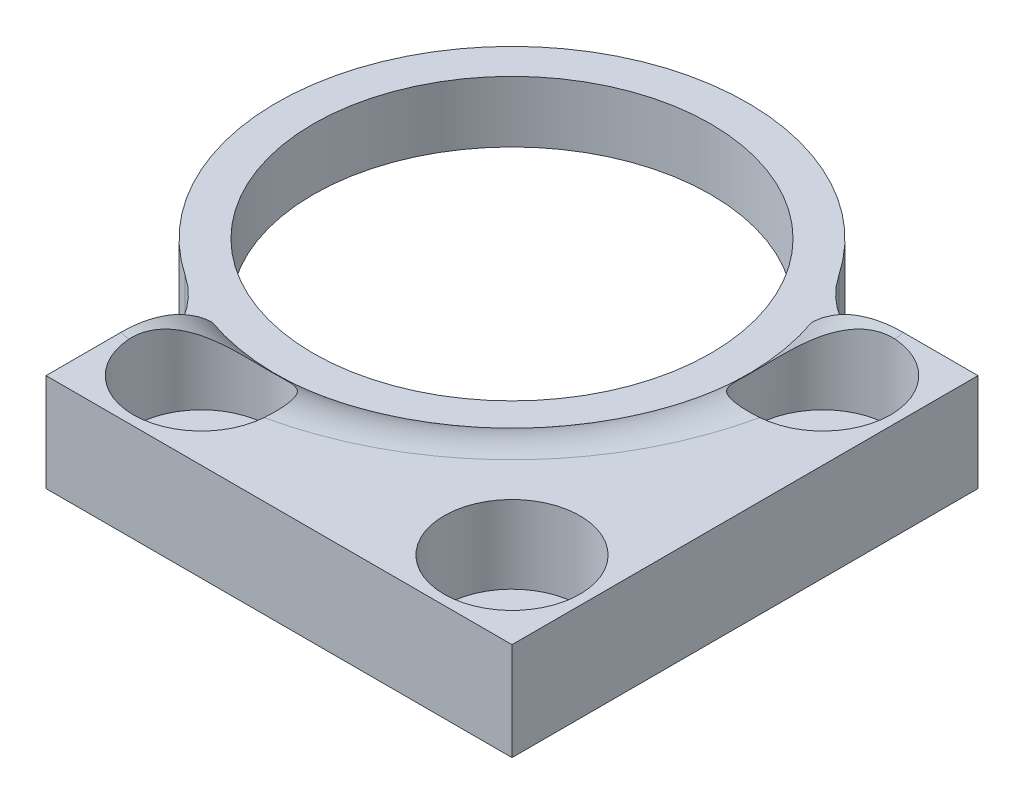
ISO-10303-21;
HEADER;
FILE_DESCRIPTION(('STEP AP214'),'2;1');
FILE_NAME('part.step','',(''),(''),'','','');
FILE_SCHEMA(('AUTOMOTIVE_DESIGN { 1 0 10303 214 1 1 1 1 }'));
ENDSEC;
DATA;
#1=APPLICATION_CONTEXT('core data for automotive mechanical design processes');
#2=APPLICATION_PROTOCOL_DEFINITION('international standard','automotive_design',2000,#1);
#3=PRODUCT_CONTEXT('',#1,'mechanical');
#4=PRODUCT('Part','Part','',(#3));
#5=PRODUCT_RELATED_PRODUCT_CATEGORY('part','',(#4));
#6=PRODUCT_DEFINITION_FORMATION('','',#4);
#7=PRODUCT_DEFINITION_CONTEXT('part definition',#1,'design');
#8=PRODUCT_DEFINITION('design','',#6,#7);
#9=PRODUCT_DEFINITION_SHAPE('','',#8);
#10=(LENGTH_UNIT() NAMED_UNIT(*) SI_UNIT(.MILLI.,.METRE.));
#11=(NAMED_UNIT(*) PLANE_ANGLE_UNIT() SI_UNIT($,.RADIAN.));
#12=(NAMED_UNIT(*) SI_UNIT($,.STERADIAN.) SOLID_ANGLE_UNIT());
#13=UNCERTAINTY_MEASURE_WITH_UNIT(LENGTH_MEASURE(1.E-05),#10,'distance_accuracy_value','');
#14=(GEOMETRIC_REPRESENTATION_CONTEXT(3) GLOBAL_UNCERTAINTY_ASSIGNED_CONTEXT((#13)) GLOBAL_UNIT_ASSIGNED_CONTEXT((#10,
#11,#12)) REPRESENTATION_CONTEXT('',''));
#15=CARTESIAN_POINT('',(0.,0.,0.));
#16=DIRECTION('',(0.,0.,1.));
#17=DIRECTION('',(1.,0.,0.));
#18=AXIS2_PLACEMENT_3D('',#15,#16,#17);
#19=CARTESIAN_POINT('',(0.,5.,0.));
#20=DIRECTION('',(0.,1.,0.));
#21=DIRECTION('',(0.,0.,1.));
#22=AXIS2_PLACEMENT_3D('',#19,#20,#21);
#23=PLANE('',#22);
#24=CARTESIAN_POINT('',(0.,5.,0.));
#25=DIRECTION('',(0.,1.,0.));
#26=DIRECTION('',(0.,0.,1.));
#27=AXIS2_PLACEMENT_3D('',#24,#25,#26);
#28=CIRCLE('',#27,19.25);
#29=CARTESIAN_POINT('',(-6.34999999999972,5.,18.172506706561));
#30=VERTEX_POINT('',#29);
#31=CARTESIAN_POINT('',(18.1725067065607,5.,-6.35000000000036));
#32=VERTEX_POINT('',#31);
#33=EDGE_CURVE('E174',#30,#32,#28,.T.);
#34=ORIENTED_EDGE('',*,*,#33,.T.);
#35=DIRECTION('',(-1.,0.,0.));
#36=VECTOR('',#35,1.);
#37=CARTESIAN_POINT('',(0.,5.,-6.35000000000036));
#38=LINE('',#37,#36);
#39=CARTESIAN_POINT('',(24.253659517689,5.,-6.35000000000036));
#40=VERTEX_POINT('',#39);
#41=EDGE_CURVE('E183',#40,#32,#38,.T.);
#42=ORIENTED_EDGE('',*,*,#41,.F.);
#43=CARTESIAN_POINT('',(24.253659517689,5.,-16.3500000000004));
#44=DIRECTION('',(0.,1.,0.));
#45=DIRECTION('',(0.,0.,1.));
#46=AXIS2_PLACEMENT_3D('',#43,#44,#45);
#47=CIRCLE('',#46,10.);
#48=CARTESIAN_POINT('',(15.9618101099321,5.,-10.7602564102566));
#49=VERTEX_POINT('',#48);
#50=EDGE_CURVE('E340',#40,#49,#47,.F.);
#51=ORIENTED_EDGE('',*,*,#50,.T.);
#52=CARTESIAN_POINT('',(-10.7602564102562,5.,15.9618101099324));
#53=VERTEX_POINT('',#52);
#54=EDGE_CURVE('E170',#49,#53,#28,.T.);
#55=ORIENTED_EDGE('',*,*,#54,.T.);
#56=CARTESIAN_POINT('',(-16.3499999999997,5.,24.2536595176895));
#57=DIRECTION('',(0.,1.,0.));
#58=DIRECTION('',(0.,0.,1.));
#59=AXIS2_PLACEMENT_3D('',#56,#57,#58);
#60=CIRCLE('',#59,10.);
#61=CARTESIAN_POINT('',(-6.34999999999972,5.,24.2536595176895));
#62=VERTEX_POINT('',#61);
#63=EDGE_CURVE('E44',#53,#62,#60,.F.);
#64=ORIENTED_EDGE('',*,*,#63,.T.);
#65=DIRECTION('',(0.,0.,1.));
#66=VECTOR('',#65,1.);
#67=CARTESIAN_POINT('',(-6.34999999999972,5.,0.));
#68=LINE('',#67,#66);
#69=EDGE_CURVE('E51',#30,#62,#68,.T.);
#70=ORIENTED_EDGE('',*,*,#69,.F.);
#71=EDGE_LOOP('',(#34,#42,#51,#55,#64,#70));
#72=FACE_BOUND('',#71,.T.);
#73=CARTESIAN_POINT('',(0.,5.,0.));
#74=DIRECTION('',(0.,1.,0.));
#75=DIRECTION('',(0.,0.,1.));
#76=AXIS2_PLACEMENT_3D('',#73,#74,#75);
#77=CIRCLE('',#76,16.25);
#78=CARTESIAN_POINT('',(0.,5.,16.25));
#79=VERTEX_POINT('',#78);
#80=EDGE_CURVE('E164',#79,#79,#77,.T.);
#81=ORIENTED_EDGE('',*,*,#80,.F.);
#82=EDGE_LOOP('',(#81));
#83=FACE_BOUND('',#82,.T.);
#84=ADVANCED_FACE('F35',(#72,#83),#23,.T.);
#85=CARTESIAN_POINT('',(0.,0.,0.));
#86=DIRECTION('',(0.,1.,0.));
#87=DIRECTION('',(0.,0.,1.));
#88=AXIS2_PLACEMENT_3D('',#85,#86,#87);
#89=PLANE('',#88);
#90=CARTESIAN_POINT('',(2.77555756156289E-13,0.,25.4));
#91=DIRECTION('',(0.,1.,0.));
#92=DIRECTION('',(0.,0.,1.));
#93=AXIS2_PLACEMENT_3D('',#90,#91,#92);
#94=CIRCLE('',#93,3.3782);
#95=CARTESIAN_POINT('',(2.77555756156289E-13,0.,28.7782));
#96=VERTEX_POINT('',#95);
#97=EDGE_CURVE('E329',#96,#96,#94,.T.);
#98=ORIENTED_EDGE('',*,*,#97,.T.);
#99=EDGE_LOOP('',(#98));
#100=FACE_BOUND('',#99,.T.);
#101=CARTESIAN_POINT('',(25.4000000000003,0.,25.3999999999996));
#102=DIRECTION('',(0.,1.,0.));
#103=DIRECTION('',(0.,0.,1.));
#104=AXIS2_PLACEMENT_3D('',#101,#102,#103);
#105=CIRCLE('',#104,3.3782);
#106=CARTESIAN_POINT('',(25.4000000000003,0.,28.7781999999996));
#107=VERTEX_POINT('',#106);
#108=EDGE_CURVE('E305',#107,#107,#105,.T.);
#109=ORIENTED_EDGE('',*,*,#108,.T.);
#110=EDGE_LOOP('',(#109));
#111=FACE_BOUND('',#110,.T.);
#112=CARTESIAN_POINT('',(25.4,0.,-3.60822483003176E-13));
#113=DIRECTION('',(0.,1.,0.));
#114=DIRECTION('',(0.,0.,1.));
#115=AXIS2_PLACEMENT_3D('',#112,#113,#114);
#116=CIRCLE('',#115,3.3782);
#117=CARTESIAN_POINT('',(25.4,0.,3.37819999999964));
#118=VERTEX_POINT('',#117);
#119=EDGE_CURVE('E155',#118,#118,#116,.T.);
#120=ORIENTED_EDGE('',*,*,#119,.T.);
#121=EDGE_LOOP('',(#120));
#122=FACE_BOUND('',#121,.T.);
#123=CARTESIAN_POINT('',(0.,0.,0.));
#124=DIRECTION('',(0.,1.,0.));
#125=DIRECTION('',(0.,0.,1.));
#126=AXIS2_PLACEMENT_3D('',#123,#124,#125);
#127=CIRCLE('',#126,19.25);
#128=CARTESIAN_POINT('',(15.9618101099321,0.,-10.7602564102566));
#129=VERTEX_POINT('',#128);
#130=CARTESIAN_POINT('',(-10.7602564102562,0.,15.9618101099324));
#131=VERTEX_POINT('',#130);
#132=EDGE_CURVE('E167',#129,#131,#127,.T.);
#133=ORIENTED_EDGE('',*,*,#132,.F.);
#134=CARTESIAN_POINT('',(24.253659517689,0.,-16.3500000000004));
#135=DIRECTION('',(0.,1.,0.));
#136=DIRECTION('',(0.,0.,1.));
#137=AXIS2_PLACEMENT_3D('',#134,#135,#136);
#138=CIRCLE('',#137,10.);
#139=CARTESIAN_POINT('',(24.253659517689,0.,-6.35000000000036));
#140=VERTEX_POINT('',#139);
#141=EDGE_CURVE('E341',#129,#140,#138,.T.);
#142=ORIENTED_EDGE('',*,*,#141,.T.);
#143=DIRECTION('',(-1.,0.,0.));
#144=VECTOR('',#143,1.);
#145=CARTESIAN_POINT('',(0.,0.,-6.35000000000036));
#146=LINE('',#145,#144);
#147=CARTESIAN_POINT('',(31.7500000000003,0.,-6.35000000000036));
#148=VERTEX_POINT('',#147);
#149=EDGE_CURVE('E141',#148,#140,#146,.T.);
#150=ORIENTED_EDGE('',*,*,#149,.F.);
#151=DIRECTION('',(0.,0.,-1.));
#152=VECTOR('',#151,1.);
#153=CARTESIAN_POINT('',(31.7500000000003,0.,0.));
#154=LINE('',#153,#152);
#155=CARTESIAN_POINT('',(31.7500000000003,0.,31.7499999999996));
#156=VERTEX_POINT('',#155);
#157=EDGE_CURVE('E157',#156,#148,#154,.T.);
#158=ORIENTED_EDGE('',*,*,#157,.F.);
#159=DIRECTION('',(-1.,0.,0.));
#160=VECTOR('',#159,1.);
#161=CARTESIAN_POINT('',(0.,0.,31.7499999999996));
#162=LINE('',#161,#160);
#163=CARTESIAN_POINT('',(-6.34999999999972,0.,31.7499999999996));
#164=VERTEX_POINT('',#163);
#165=EDGE_CURVE('E154',#156,#164,#162,.T.);
#166=ORIENTED_EDGE('',*,*,#165,.T.);
#167=DIRECTION('',(0.,0.,-1.));
#168=VECTOR('',#167,1.);
#169=CARTESIAN_POINT('',(-6.34999999999972,0.,0.));
#170=LINE('',#169,#168);
#171=CARTESIAN_POINT('',(-6.34999999999972,0.,24.2536595176895));
#172=VERTEX_POINT('',#171);
#173=EDGE_CURVE('E127',#164,#172,#170,.T.);
#174=ORIENTED_EDGE('',*,*,#173,.T.);
#175=CARTESIAN_POINT('',(-16.3499999999997,0.,24.2536595176895));
#176=DIRECTION('',(0.,1.,0.));
#177=DIRECTION('',(0.,0.,1.));
#178=AXIS2_PLACEMENT_3D('',#175,#176,#177);
#179=CIRCLE('',#178,10.);
#180=EDGE_CURVE('E11',#172,#131,#179,.T.);
#181=ORIENTED_EDGE('',*,*,#180,.T.);
#182=EDGE_LOOP('',(#133,#142,#150,#158,#166,#174,#181));
#183=FACE_BOUND('',#182,.T.);
#184=CARTESIAN_POINT('',(0.,0.,0.));
#185=DIRECTION('',(0.,1.,0.));
#186=DIRECTION('',(0.,0.,1.));
#187=AXIS2_PLACEMENT_3D('',#184,#185,#186);
#188=CIRCLE('',#187,16.25);
#189=CARTESIAN_POINT('',(0.,0.,16.25));
#190=VERTEX_POINT('',#189);
#191=EDGE_CURVE('E132',#190,#190,#188,.T.);
#192=ORIENTED_EDGE('',*,*,#191,.T.);
#193=EDGE_LOOP('',(#192));
#194=FACE_BOUND('',#193,.T.);
#195=ADVANCED_FACE('F256',(#100,#111,#122,#183,#194),#89,.F.);
#196=CARTESIAN_POINT('',(0.,5.,0.));
#197=DIRECTION('',(0.,-1.,0.));
#198=DIRECTION('',(0.,0.,-1.));
#199=AXIS2_PLACEMENT_3D('',#196,#197,#198);
#200=CYLINDRICAL_SURFACE('',#199,19.25);
#201=ORIENTED_EDGE('',*,*,#54,.F.);
#202=DIRECTION('',(0.,-1.,0.));
#203=VECTOR('',#202,1.);
#204=CARTESIAN_POINT('',(15.9618101099321,5.,-10.7602564102566));
#205=LINE('',#204,#203);
#206=EDGE_CURVE('E211',#49,#129,#205,.T.);
#207=ORIENTED_EDGE('',*,*,#206,.T.);
#208=ORIENTED_EDGE('',*,*,#132,.T.);
#209=DIRECTION('',(0.,-1.,0.));
#210=VECTOR('',#209,1.);
#211=CARTESIAN_POINT('',(-10.7602564102562,5.,15.9618101099324));
#212=LINE('',#211,#210);
#213=EDGE_CURVE('E284',#131,#53,#212,.F.);
#214=ORIENTED_EDGE('',*,*,#213,.T.);
#215=EDGE_LOOP('',(#201,#207,#208,#214));
#216=FACE_BOUND('',#215,.T.);
#217=ADVANCED_FACE('F261',(#216),#200,.T.);
#218=CARTESIAN_POINT('',(0.,5.,0.));
#219=DIRECTION('',(0.,-1.,0.));
#220=DIRECTION('',(0.,0.,-1.));
#221=AXIS2_PLACEMENT_3D('',#218,#219,#220);
#222=CYLINDRICAL_SURFACE('',#221,16.25);
#223=ORIENTED_EDGE('',*,*,#80,.T.);
#224=EDGE_LOOP('',(#223));
#225=FACE_BOUND('',#224,.T.);
#226=ORIENTED_EDGE('',*,*,#191,.F.);
#227=EDGE_LOOP('',(#226));
#228=FACE_BOUND('',#227,.T.);
#229=ADVANCED_FACE('F201',(#225,#228),#222,.F.);
#230=CARTESIAN_POINT('',(-6.34999999999972,8.,0.));
#231=DIRECTION('',(-1.,0.,0.));
#232=DIRECTION('',(0.,0.,1.));
#233=AXIS2_PLACEMENT_3D('',#230,#231,#232);
#234=PLANE('',#233);
#235=ORIENTED_EDGE('',*,*,#69,.T.);
#236=DIRECTION('',(0.,-1.,0.));
#237=VECTOR('',#236,1.);
#238=CARTESIAN_POINT('',(-6.34999999999972,8.,24.2536595176895));
#239=LINE('',#238,#237);
#240=EDGE_CURVE('E214',#62,#172,#239,.T.);
#241=ORIENTED_EDGE('',*,*,#240,.T.);
#242=ORIENTED_EDGE('',*,*,#173,.F.);
#243=DIRECTION('',(0.,-1.,0.));
#244=VECTOR('',#243,1.);
#245=CARTESIAN_POINT('',(-6.34999999999972,8.,31.7499999999996));
#246=LINE('',#245,#244);
#247=CARTESIAN_POINT('',(-6.34999999999972,8.,31.7499999999996));
#248=VERTEX_POINT('',#247);
#249=EDGE_CURVE('E121',#248,#164,#246,.T.);
#250=ORIENTED_EDGE('',*,*,#249,.F.);
#251=DIRECTION('',(0.,0.,-1.));
#252=VECTOR('',#251,1.);
#253=CARTESIAN_POINT('',(-6.34999999999972,8.,0.));
#254=LINE('',#253,#252);
#255=CARTESIAN_POINT('',(-6.34999999999972,8.,25.6161081060122));
#256=VERTEX_POINT('',#255);
#257=EDGE_CURVE('E124',#248,#256,#254,.T.);
#258=ORIENTED_EDGE('',*,*,#257,.T.);
#259=CARTESIAN_POINT('',(-6.34999999999972,8.,25.6161081060122));
#260=CARTESIAN_POINT('',(-6.34999999999972,8.00002879396397,25.3141181176366));
#261=CARTESIAN_POINT('',(-6.34999999999972,7.98711361691623,25.0121460611199));
#262=CARTESIAN_POINT('',(-6.34999999999972,7.93576813785406,24.4104024615457));
#263=CARTESIAN_POINT('',(-6.34999999999972,7.89734002561636,24.1106307318665));
#264=CARTESIAN_POINT('',(-6.34999999999972,7.79527495413419,23.5150122828119));
#265=CARTESIAN_POINT('',(-6.34999999999972,7.73160523047728,23.2191711834055));
#266=CARTESIAN_POINT('',(-6.34999999999972,7.57962127259022,22.6338997453216));
#267=CARTESIAN_POINT('',(-6.34999999999972,7.49130773299933,22.3444692261963));
#268=CARTESIAN_POINT('',(-6.34999999999972,7.29069872802152,21.7739806507372));
#269=CARTESIAN_POINT('',(-6.34999999999972,7.17839858523421,21.492924239557));
#270=CARTESIAN_POINT('',(-6.34999999999972,6.93061219174298,20.941172717199));
#271=CARTESIAN_POINT('',(-6.34999999999972,6.79512258835815,20.6704791111873));
#272=CARTESIAN_POINT('',(-6.34999999999972,6.50221462848449,20.1420137684019));
#273=CARTESIAN_POINT('',(-6.34999999999972,6.34484499898933,19.8842150032864));
#274=CARTESIAN_POINT('',(-6.34999999999972,6.00902825023917,19.3828848599341));
#275=CARTESIAN_POINT('',(-6.34999999999972,5.83059268508641,19.1393457692963));
#276=CARTESIAN_POINT('',(-6.34999999999972,5.54076454838766,18.777061619529));
#277=CARTESIAN_POINT('',(-6.34999999999972,5.43644193819702,18.6526004737792));
#278=CARTESIAN_POINT('',(-6.34999999999972,5.22231281880198,18.4087380543067));
#279=CARTESIAN_POINT('',(-6.34999999999972,5.11251263975999,18.2893312217304));
#280=CARTESIAN_POINT('',(-6.34999999999972,5.00000000000001,18.172506706561));
#281=B_SPLINE_CURVE_WITH_KNOTS('',3,(#259,#260,#261,#262,#263,#264,#265,#266,#267,#268,#269,
#270,#271,#272,#273,#274,#275,#276,#277,#278,#279,#280),.UNSPECIFIED.,.F.,.F.,(4,2,2,2,2,2,2,2,
2,2,4),(0.,0.905668008604802,1.81125829371824,2.71802793282939,3.62477201525828,
4.53169307495352,5.43874536622154,6.34380907033306,7.24837865743327,7.73542737365006,
8.22192571230276),.UNSPECIFIED.);
#282=EDGE_CURVE('E204',#256,#30,#281,.T.);
#283=ORIENTED_EDGE('',*,*,#282,.T.);
#284=EDGE_LOOP('',(#235,#241,#242,#250,#258,#283));
#285=FACE_BOUND('',#284,.T.);
#286=ADVANCED_FACE('F123',(#285),#234,.T.);
#287=CARTESIAN_POINT('',(0.,8.,31.7499999999996));
#288=DIRECTION('',(0.,0.,1.));
#289=DIRECTION('',(1.,0.,0.));
#290=AXIS2_PLACEMENT_3D('',#287,#288,#289);
#291=PLANE('',#290);
#292=ORIENTED_EDGE('',*,*,#165,.F.);
#293=DIRECTION('',(0.,-1.,0.));
#294=VECTOR('',#293,1.);
#295=CARTESIAN_POINT('',(31.7500000000003,8.,31.7499999999996));
#296=LINE('',#295,#294);
#297=CARTESIAN_POINT('',(31.7500000000003,8.,31.7499999999996));
#298=VERTEX_POINT('',#297);
#299=EDGE_CURVE('E133',#298,#156,#296,.T.);
#300=ORIENTED_EDGE('',*,*,#299,.F.);
#301=DIRECTION('',(-1.,0.,0.));
#302=VECTOR('',#301,1.);
#303=CARTESIAN_POINT('',(0.,8.,31.7499999999996));
#304=LINE('',#303,#302);
#305=EDGE_CURVE('E137',#298,#248,#304,.T.);
#306=ORIENTED_EDGE('',*,*,#305,.T.);
#307=ORIENTED_EDGE('',*,*,#249,.T.);
#308=EDGE_LOOP('',(#292,#300,#306,#307));
#309=FACE_BOUND('',#308,.T.);
#310=ADVANCED_FACE('F143',(#309),#291,.T.);
#311=CARTESIAN_POINT('',(31.7500000000003,8.,0.));
#312=DIRECTION('',(-1.,0.,0.));
#313=DIRECTION('',(0.,0.,1.));
#314=AXIS2_PLACEMENT_3D('',#311,#312,#313);
#315=PLANE('',#314);
#316=ORIENTED_EDGE('',*,*,#157,.T.);
#317=DIRECTION('',(0.,-1.,0.));
#318=VECTOR('',#317,1.);
#319=CARTESIAN_POINT('',(31.7500000000003,8.,-6.35000000000036));
#320=LINE('',#319,#318);
#321=CARTESIAN_POINT('',(31.7500000000003,8.,-6.35000000000036));
#322=VERTEX_POINT('',#321);
#323=EDGE_CURVE('E152',#322,#148,#320,.T.);
#324=ORIENTED_EDGE('',*,*,#323,.F.);
#325=DIRECTION('',(0.,0.,-1.));
#326=VECTOR('',#325,1.);
#327=CARTESIAN_POINT('',(31.7500000000003,8.,0.));
#328=LINE('',#327,#326);
#329=EDGE_CURVE('E145',#298,#322,#328,.T.);
#330=ORIENTED_EDGE('',*,*,#329,.F.);
#331=ORIENTED_EDGE('',*,*,#299,.T.);
#332=EDGE_LOOP('',(#316,#324,#330,#331));
#333=FACE_BOUND('',#332,.T.);
#334=ADVANCED_FACE('F190',(#333),#315,.F.);
#335=CARTESIAN_POINT('',(0.,8.,-6.35000000000036));
#336=DIRECTION('',(0.,0.,1.));
#337=DIRECTION('',(1.,0.,0.));
#338=AXIS2_PLACEMENT_3D('',#335,#336,#337);
#339=PLANE('',#338);
#340=ORIENTED_EDGE('',*,*,#149,.T.);
#341=DIRECTION('',(0.,1.,0.));
#342=VECTOR('',#341,1.);
#343=CARTESIAN_POINT('',(24.253659517689,5.,-6.35000000000036));
#344=LINE('',#343,#342);
#345=EDGE_CURVE('E291',#140,#40,#344,.T.);
#346=ORIENTED_EDGE('',*,*,#345,.T.);
#347=ORIENTED_EDGE('',*,*,#41,.T.);
#348=CARTESIAN_POINT('',(18.1725067065607,5.,-6.35000000000036));
#349=CARTESIAN_POINT('',(18.3898569748787,5.20935287886082,-6.35000000000036));
#350=CARTESIAN_POINT('',(18.6162059057067,5.40932392187117,-6.35000000000036));
#351=CARTESIAN_POINT('',(19.0850266670672,5.78933053834929,-6.35000000000036));
#352=CARTESIAN_POINT('',(19.3274967988749,5.96936820692719,-6.35000000000036));
#353=CARTESIAN_POINT('',(19.8270442026094,6.30859278400928,-6.35000000000036));
#354=CARTESIAN_POINT('',(20.084139362018,6.4677533364716,-6.35000000000036));
#355=CARTESIAN_POINT('',(20.6107719030725,6.76393677364383,-6.35000000000036));
#356=CARTESIAN_POINT('',(20.8803090580493,6.90096006144744,-6.35000000000036));
#357=CARTESIAN_POINT('',(21.4299746649929,7.15197866987694,-6.35000000000036));
#358=CARTESIAN_POINT('',(21.7101055359338,7.26596869292262,-6.35000000000036));
#359=CARTESIAN_POINT('',(22.2789355862923,7.47006864475646,-6.35000000000036));
#360=CARTESIAN_POINT('',(22.5676346586421,7.56017887180562,-6.35000000000036));
#361=CARTESIAN_POINT('',(23.1509636437534,7.71566443482826,-6.35000000000036));
#362=CARTESIAN_POINT('',(23.4455798907994,7.78109110448386,-6.35000000000036));
#363=CARTESIAN_POINT('',(24.039154082326,7.88689039997734,-6.35000000000036));
#364=CARTESIAN_POINT('',(24.338109615579,7.92727643296028,-6.35000000000036));
#365=CARTESIAN_POINT('',(24.8008067017799,7.96995239153565,-6.35000000000036));
#366=CARTESIAN_POINT('',(24.9637672394544,7.98121878981724,-6.35000000000036));
#367=CARTESIAN_POINT('',(25.2898479080921,7.99623842904673,-6.35000000000036));
#368=CARTESIAN_POINT('',(25.4529676456157,8.00000021640151,-6.35000000000036));
#369=CARTESIAN_POINT('',(25.616108106012,8.,-6.35000000000036));
#370=B_SPLINE_CURVE_WITH_KNOTS('',3,(#348,#349,#350,#351,#352,#353,#354,#355,#356,#357,#358,
#359,#360,#361,#362,#363,#364,#365,#366,#367,#368,#369),.UNSPECIFIED.,.F.,.F.,(4,2,2,2,2,2,2,2,
2,2,4),(0.,0.905016262850308,1.80993731290322,2.71598999359725,3.622026174272,4.52827050388821,
5.4345035138899,6.33884132978401,7.24269453012584,7.73259007301606,8.22192739347473),.UNSPECIFIED.);
#371=CARTESIAN_POINT('',(25.616108106012,8.,-6.35000000000036));
#372=VERTEX_POINT('',#371);
#373=EDGE_CURVE('E173',#32,#372,#370,.T.);
#374=ORIENTED_EDGE('',*,*,#373,.T.);
#375=DIRECTION('',(-1.,0.,0.));
#376=VECTOR('',#375,1.);
#377=CARTESIAN_POINT('',(0.,8.,-6.35000000000036));
#378=LINE('',#377,#376);
#379=EDGE_CURVE('E147',#322,#372,#378,.T.);
#380=ORIENTED_EDGE('',*,*,#379,.F.);
#381=ORIENTED_EDGE('',*,*,#323,.T.);
#382=EDGE_LOOP('',(#340,#346,#347,#374,#380,#381));
#383=FACE_BOUND('',#382,.T.);
#384=ADVANCED_FACE('F185',(#383),#339,.F.);
#385=CARTESIAN_POINT('',(0.,8.,0.));
#386=DIRECTION('',(0.,1.,0.));
#387=DIRECTION('',(0.,0.,1.));
#388=AXIS2_PLACEMENT_3D('',#385,#386,#387);
#389=PLANE('',#388);
#390=CARTESIAN_POINT('',(25.4000000000003,8.,25.3999999999996));
#391=DIRECTION('',(0.,1.,0.));
#392=DIRECTION('',(0.,0.,1.));
#393=AXIS2_PLACEMENT_3D('',#390,#391,#392);
#394=CIRCLE('',#393,5.55625);
#395=CARTESIAN_POINT('',(25.4000000000003,8.,30.9562499999996));
#396=VERTEX_POINT('',#395);
#397=EDGE_CURVE('E326',#396,#396,#394,.T.);
#398=ORIENTED_EDGE('',*,*,#397,.F.);
#399=EDGE_LOOP('',(#398));
#400=FACE_BOUND('',#399,.T.);
#401=ORIENTED_EDGE('',*,*,#379,.T.);
#402=CARTESIAN_POINT('',(0.,8.,0.));
#403=DIRECTION('',(0.,1.,0.));
#404=DIRECTION('',(0.,0.,1.));
#405=AXIS2_PLACEMENT_3D('',#402,#403,#404);
#406=CIRCLE('',#405,26.3914284285428);
#407=CARTESIAN_POINT('',(25.8030626070157,8.,-5.54161119146135));
#408=VERTEX_POINT('',#407);
#409=EDGE_CURVE('E59',#372,#408,#406,.F.);
#410=ORIENTED_EDGE('',*,*,#409,.T.);
#411=CARTESIAN_POINT('',(25.4,8.,-3.60822483003176E-13));
#412=DIRECTION('',(0.,1.,0.));
#413=DIRECTION('',(0.,0.,1.));
#414=AXIS2_PLACEMENT_3D('',#411,#412,#413);
#415=CIRCLE('',#414,5.55625);
#416=CARTESIAN_POINT('',(25.8030626070158,8.,5.54161119146062));
#417=VERTEX_POINT('',#416);
#418=EDGE_CURVE('E302',#417,#408,#415,.T.);
#419=ORIENTED_EDGE('',*,*,#418,.F.);
#420=CARTESIAN_POINT('',(0.,8.,0.));
#421=DIRECTION('',(0.,1.,0.));
#422=DIRECTION('',(0.,0.,1.));
#423=AXIS2_PLACEMENT_3D('',#420,#421,#422);
#424=CIRCLE('',#423,26.3914284285428);
#425=CARTESIAN_POINT('',(5.54161119146127,8.,25.8030626070157));
#426=VERTEX_POINT('',#425);
#427=EDGE_CURVE('E217',#417,#426,#424,.F.);
#428=ORIENTED_EDGE('',*,*,#427,.T.);
#429=CARTESIAN_POINT('',(2.77555756156289E-13,8.,25.4));
#430=DIRECTION('',(0.,1.,0.));
#431=DIRECTION('',(0.,0.,1.));
#432=AXIS2_PLACEMENT_3D('',#429,#430,#431);
#433=CIRCLE('',#432,5.55625);
#434=CARTESIAN_POINT('',(-5.5416111914607,8.,25.8030626070158));
#435=VERTEX_POINT('',#434);
#436=EDGE_CURVE('E338',#435,#426,#433,.T.);
#437=ORIENTED_EDGE('',*,*,#436,.F.);
#438=CARTESIAN_POINT('',(0.,8.,0.));
#439=DIRECTION('',(0.,1.,0.));
#440=DIRECTION('',(0.,0.,1.));
#441=AXIS2_PLACEMENT_3D('',#438,#439,#440);
#442=CIRCLE('',#441,26.3914284285428);
#443=EDGE_CURVE('E140',#435,#256,#442,.F.);
#444=ORIENTED_EDGE('',*,*,#443,.T.);
#445=ORIENTED_EDGE('',*,*,#257,.F.);
#446=ORIENTED_EDGE('',*,*,#305,.F.);
#447=ORIENTED_EDGE('',*,*,#329,.T.);
#448=EDGE_LOOP('',(#401,#410,#419,#428,#437,#444,#445,#446,#447));
#449=FACE_BOUND('',#448,.T.);
#450=ADVANCED_FACE('F136',(#400,#449),#389,.T.);
#451=CARTESIAN_POINT('',(25.4,8.,-3.60822483003176E-13));
#452=DIRECTION('',(0.,1.,0.));
#453=DIRECTION('',(0.,0.,1.));
#454=AXIS2_PLACEMENT_3D('',#451,#452,#453);
#455=CYLINDRICAL_SURFACE('',#454,3.3782);
#456=ORIENTED_EDGE('',*,*,#119,.F.);
#457=EDGE_LOOP('',(#456));
#458=FACE_BOUND('',#457,.T.);
#459=CARTESIAN_POINT('',(25.4,1.65,-3.60822483003176E-13));
#460=DIRECTION('',(0.,1.,0.));
#461=DIRECTION('',(0.,0.,1.));
#462=AXIS2_PLACEMENT_3D('',#459,#460,#461);
#463=CIRCLE('',#462,3.37820000000001);
#464=CARTESIAN_POINT('',(25.4,1.65,3.37819999999965));
#465=VERTEX_POINT('',#464);
#466=EDGE_CURVE('E308',#465,#465,#463,.T.);
#467=ORIENTED_EDGE('',*,*,#466,.T.);
#468=EDGE_LOOP('',(#467));
#469=FACE_BOUND('',#468,.T.);
#470=ADVANCED_FACE('F244',(#458,#469),#455,.F.);
#471=CARTESIAN_POINT('',(28.7782,1.65,-3.60822483003176E-13));
#472=DIRECTION('',(0.,-1.,0.));
#473=DIRECTION('',(0.,0.,-1.));
#474=AXIS2_PLACEMENT_3D('',#471,#472,#473);
#475=PLANE('',#474);
#476=ORIENTED_EDGE('',*,*,#466,.F.);
#477=EDGE_LOOP('',(#476));
#478=FACE_BOUND('',#477,.T.);
#479=CARTESIAN_POINT('',(25.4,1.65,-3.60822483003176E-13));
#480=DIRECTION('',(0.,1.,0.));
#481=DIRECTION('',(0.,0.,1.));
#482=AXIS2_PLACEMENT_3D('',#479,#480,#481);
#483=CIRCLE('',#482,5.55625);
#484=CARTESIAN_POINT('',(25.4,1.65,5.55624999999963));
#485=VERTEX_POINT('',#484);
#486=EDGE_CURVE('E304',#485,#485,#483,.T.);
#487=ORIENTED_EDGE('',*,*,#486,.T.);
#488=EDGE_LOOP('',(#487));
#489=FACE_BOUND('',#488,.T.);
#490=ADVANCED_FACE('F240',(#478,#489),#475,.F.);
#491=CARTESIAN_POINT('',(25.4,8.,-3.60822483003176E-13));
#492=DIRECTION('',(0.,1.,0.));
#493=DIRECTION('',(0.,0.,1.));
#494=AXIS2_PLACEMENT_3D('',#491,#492,#493);
#495=CYLINDRICAL_SURFACE('',#494,5.55625);
#496=ORIENTED_EDGE('',*,*,#486,.F.);
#497=EDGE_LOOP('',(#496));
#498=FACE_BOUND('',#497,.T.);
#499=ORIENTED_EDGE('',*,*,#418,.T.);
#500=CARTESIAN_POINT('',(25.8030626070157,8.,-5.54161119146135));
#501=CARTESIAN_POINT('',(25.6624939172008,8.00002225546085,-5.5518600787082));
#502=CARTESIAN_POINT('',(25.521528274254,7.99725582321591,-5.55671238056076));
#503=CARTESIAN_POINT('',(25.2398848452728,7.985954236394,-5.55572062586745));
#504=CARTESIAN_POINT('',(25.0992070243184,7.97741982906366,-5.54987795469797));
#505=CARTESIAN_POINT('',(24.8197592308905,7.95443835363913,-5.52764144098817));
#506=CARTESIAN_POINT('',(24.6809837948633,7.94001571992292,-5.51129104328513));
#507=CARTESIAN_POINT('',(24.4057874416861,7.90523860725249,-5.46834936314992));
#508=CARTESIAN_POINT('',(24.2693664670104,7.88488427344348,-5.44175833129494));
#509=CARTESIAN_POINT('',(23.9998608364096,7.83835676137657,-5.37872436625131));
#510=CARTESIAN_POINT('',(23.8667756849072,7.81218445321961,-5.34228290605712));
#511=CARTESIAN_POINT('',(23.6047355371282,7.75425517030808,-5.2600196131615));
#512=CARTESIAN_POINT('',(23.4757821483323,7.7224960524332,-5.21419417962324));
#513=CARTESIAN_POINT('',(23.222799957528,7.65376921659177,-5.11373046706434));
#514=CARTESIAN_POINT('',(23.0987711696759,7.61680148365413,-5.05909216271287));
#515=CARTESIAN_POINT('',(22.8561983889687,7.53811843991671,-4.94157462890969));
#516=CARTESIAN_POINT('',(22.7376564729203,7.49640135180176,-4.87869231302102));
#517=CARTESIAN_POINT('',(22.5018985069533,7.40701948529669,-4.7425932899059));
#518=CARTESIAN_POINT('',(22.3849300302636,7.35918238435982,-4.66906145274921));
#519=CARTESIAN_POINT('',(22.1578334445336,7.25968395650856,-4.51432829852768));
#520=CARTESIAN_POINT('',(22.0477082011632,7.2080210470848,-4.43312380386554));
#521=CARTESIAN_POINT('',(21.834536580435,7.1016327814714,-4.26356056548615));
#522=CARTESIAN_POINT('',(21.7314956410873,7.04690512994257,-4.17519643681516));
#523=CARTESIAN_POINT('',(21.5327610129001,6.93527256884842,-3.99182434644644));
#524=CARTESIAN_POINT('',(21.4370681527034,6.87836741480713,-3.89681563774104));
#525=CARTESIAN_POINT('',(21.2381079437645,6.75387800652061,-3.68443614462177));
#526=CARTESIAN_POINT('',(21.1361662913765,6.6860709429713,-3.56595117826245));
#527=CARTESIAN_POINT('',(20.9426126492604,6.55035509972079,-3.32084484666731));
#528=CARTESIAN_POINT('',(20.8510028699104,6.48244630139154,-3.19422174943964));
#529=CARTESIAN_POINT('',(20.6783970780848,6.34836552155972,-2.93306402236389));
#530=CARTESIAN_POINT('',(20.5973995704444,6.28219329644388,-2.7985305108933));
#531=CARTESIAN_POINT('',(20.4464552154061,6.15373761539788,-2.52174079760129));
#532=CARTESIAN_POINT('',(20.3765046692437,6.09145286209934,-2.3794872021593));
#533=CARTESIAN_POINT('',(20.2182270490227,5.94554947280697,-2.01888173731709));
#534=CARTESIAN_POINT('',(20.1365447115795,5.86552888653866,-1.7959810398847));
#535=CARTESIAN_POINT('',(20.0351142937272,5.76275263389113,-1.4506221685239));
#536=CARTESIAN_POINT('',(20.0048286029783,5.73137994567465,-1.33372324811801));
#537=CARTESIAN_POINT('',(19.9516966215417,5.67557010238934,-1.09664937009468));
#538=CARTESIAN_POINT('',(19.9288461199961,5.65112902267197,-0.976476308701972));
#539=CARTESIAN_POINT('',(19.8907726903284,5.61002824108896,-0.731998889349403));
#540=CARTESIAN_POINT('',(19.8756496662144,5.59347063767837,-0.607661533080289));
#541=CARTESIAN_POINT('',(19.8538319608567,5.56948390348486,-0.357366552127419));
#542=CARTESIAN_POINT('',(19.8471368099021,5.56205426397347,-0.231409018136365));
#543=CARTESIAN_POINT('',(19.8423586450367,5.55675904798641,0.0208264610778325));
#544=CARTESIAN_POINT('',(19.8442720330935,5.55888947577574,0.147104250394468));
#545=CARTESIAN_POINT('',(19.8566395627727,5.572562831054,0.398691357370523));
#546=CARTESIAN_POINT('',(19.8670933678269,5.58410538762146,0.524000712998385));
#547=CARTESIAN_POINT('',(19.9063748558155,5.62700927871968,0.858249242963965));
#548=CARTESIAN_POINT('',(19.9429008508194,5.66654758926719,1.06529202411151));
#549=CARTESIAN_POINT('',(20.0375389189883,5.76546238020454,1.4694215901685));
#550=CARTESIAN_POINT('',(20.0956769059324,5.82486266739553,1.66649609906707));
#551=CARTESIAN_POINT('',(20.2164666419773,5.94280717507817,2.00698889631374));
#552=CARTESIAN_POINT('',(20.2753480528265,5.99869545863609,2.15271311657642));
#553=CARTESIAN_POINT('',(20.40419100484,6.11621660367714,2.43683223923799));
#554=CARTESIAN_POINT('',(20.4741579785091,6.17785227555532,2.5752235035015));
#555=CARTESIAN_POINT('',(20.6247388454856,6.3046777870034,2.84476298382002));
#556=CARTESIAN_POINT('',(20.7053736722748,6.36987446268332,2.9758962207347));
#557=CARTESIAN_POINT('',(20.8768099341014,6.50173782025252,3.23051314260218));
#558=CARTESIAN_POINT('',(20.967609903698,6.56840428914155,3.3539979262048));
#559=CARTESIAN_POINT('',(21.1618062952157,6.7033615761248,3.59644455803764));
#560=CARTESIAN_POINT('',(21.2654820005543,6.77164622753533,3.71518632485707));
#561=CARTESIAN_POINT('',(21.4831285693852,6.90634826348272,3.94397710840073));
#562=CARTESIAN_POINT('',(21.5970989033399,6.97276574383341,4.05402657169656));
#563=CARTESIAN_POINT('',(21.8349151295977,7.10216213371048,4.26465355893395));
#564=CARTESIAN_POINT('',(21.9587445541209,7.16514649296068,4.36524629004495));
#565=CARTESIAN_POINT('',(22.2160886178162,7.28645184214887,4.55634665936296));
#566=CARTESIAN_POINT('',(22.3496015022059,7.34477367299716,4.64685611730277));
#567=CARTESIAN_POINT('',(22.6059747134216,7.44760942865141,4.80464676748879));
#568=CARTESIAN_POINT('',(22.7276185387336,7.49290425276201,4.87339783660422));
#569=CARTESIAN_POINT('',(22.9771308103697,7.57851647114131,5.00213136729239));
#570=CARTESIAN_POINT('',(23.1049982395503,7.61883467497174,5.06211525534179));
#571=CARTESIAN_POINT('',(23.3662702720204,7.69390415847447,5.17261678596742));
#572=CARTESIAN_POINT('',(23.4996722325493,7.72865805746383,5.22313888445831));
#573=CARTESIAN_POINT('',(23.771204019341,7.79215042795958,5.31407810234567));
#574=CARTESIAN_POINT('',(23.9093316132536,7.82089169534951,5.35449992009693));
#575=CARTESIAN_POINT('',(24.1903963174837,7.87224152038674,5.42493364411058));
#576=CARTESIAN_POINT('',(24.3333602736672,7.89480585992838,5.45487090049922));
#577=CARTESIAN_POINT('',(24.6220707739289,7.93337743799744,5.50346937668762));
#578=CARTESIAN_POINT('',(24.767817392401,7.9493845009598,5.52213029458013));
#579=CARTESIAN_POINT('',(25.061685902048,7.97491167053776,5.54791002861646));
#580=CARTESIAN_POINT('',(25.20981634874,7.98439645441266,5.55496627936469));
#581=CARTESIAN_POINT('',(25.5064656240443,7.99695499801934,5.5572183652299));
#582=CARTESIAN_POINT('',(25.6549845172655,8.00002761303306,5.55241208294904));
#583=CARTESIAN_POINT('',(25.8030626070158,8.,5.54161119146062));
#584=B_SPLINE_CURVE_WITH_KNOTS('',3,(#500,#501,#502,#503,#504,#505,#506,#507,#508,#509,#510,
#511,#512,#513,#514,#515,#516,#517,#518,#519,#520,#521,#522,#523,#524,#525,#526,#527,#528,#529,
#530,#531,#532,#533,#534,#535,#536,#537,#538,#539,#540,#541,#542,#543,#544,#545,#546,#547,#548,
#549,#550,#551,#552,#553,#554,#555,#556,#557,#558,#559,#560,#561,#562,#563,#564,#565,#566,#567,
#568,#569,#570,#571,#572,#573,#574,#575,#576,#577,#578,#579,#580,#581,#582,#583),.UNSPECIFIED.,
.F.,.F.,(4,2,2,2,2,2,2,2,2,2,2,2,2,2,2,2,2,2,2,2,2,2,2,2,2,2,2,2,2,2,2,2,2,2,2,2,2,2,2,2,2,4),
(0.,0.42270099468537,0.845347238551011,1.26625717084634,1.68715680458798,2.10799353343297,
2.52899205020123,2.94999177706756,3.37114957257384,3.80934255906351,4.24771782339833,
4.68642591799963,5.12518341327888,5.63578937805528,6.14650437434992,6.65714733836595,
7.16761896377951,7.91616671036765,8.29010258010563,8.66382630425128,9.04226663862904,
9.4206858804489,9.79894697253063,10.1771931584855,10.8161798477245,11.4559351959734,
11.955723571844,12.4557576320058,12.9567878782427,13.4577459870833,13.9725827276809,
14.4873930010477,15.0013607270772,15.5152355463473,15.9554471604232,16.3955870693172,
16.8355191755639,17.2752462557025,17.7180434051692,18.1608524093482,18.606041039544,
19.0513091392439),.UNSPECIFIED.);
#585=EDGE_CURVE('E220',#408,#417,#584,.T.);
#586=ORIENTED_EDGE('',*,*,#585,.T.);
#587=EDGE_LOOP('',(#499,#586));
#588=FACE_BOUND('',#587,.T.);
#589=ADVANCED_FACE('F234',(#498,#588),#495,.F.);
#590=CARTESIAN_POINT('',(25.4000000000003,8.,25.3999999999996));
#591=DIRECTION('',(0.,1.,0.));
#592=DIRECTION('',(0.,0.,1.));
#593=AXIS2_PLACEMENT_3D('',#590,#591,#592);
#594=CYLINDRICAL_SURFACE('',#593,3.3782);
#595=ORIENTED_EDGE('',*,*,#108,.F.);
#596=EDGE_LOOP('',(#595));
#597=FACE_BOUND('',#596,.T.);
#598=CARTESIAN_POINT('',(25.4000000000003,1.65,25.3999999999996));
#599=DIRECTION('',(0.,1.,0.));
#600=DIRECTION('',(0.,0.,1.));
#601=AXIS2_PLACEMENT_3D('',#598,#599,#600);
#602=CIRCLE('',#601,3.37820000000001);
#603=CARTESIAN_POINT('',(25.4000000000003,1.65,28.7781999999997));
#604=VERTEX_POINT('',#603);
#605=EDGE_CURVE('E311',#604,#604,#602,.T.);
#606=ORIENTED_EDGE('',*,*,#605,.T.);
#607=EDGE_LOOP('',(#606));
#608=FACE_BOUND('',#607,.T.);
#609=ADVANCED_FACE('F239',(#597,#608),#594,.F.);
#610=CARTESIAN_POINT('',(28.7782000000003,1.65,25.3999999999996));
#611=DIRECTION('',(0.,-1.,0.));
#612=DIRECTION('',(0.,0.,-1.));
#613=AXIS2_PLACEMENT_3D('',#610,#611,#612);
#614=PLANE('',#613);
#615=ORIENTED_EDGE('',*,*,#605,.F.);
#616=EDGE_LOOP('',(#615));
#617=FACE_BOUND('',#616,.T.);
#618=CARTESIAN_POINT('',(25.4000000000003,1.65,25.3999999999996));
#619=DIRECTION('',(0.,1.,0.));
#620=DIRECTION('',(0.,0.,1.));
#621=AXIS2_PLACEMENT_3D('',#618,#619,#620);
#622=CIRCLE('',#621,5.55625);
#623=CARTESIAN_POINT('',(25.4000000000003,1.65,30.9562499999996));
#624=VERTEX_POINT('',#623);
#625=EDGE_CURVE('E323',#624,#624,#622,.T.);
#626=ORIENTED_EDGE('',*,*,#625,.T.);
#627=EDGE_LOOP('',(#626));
#628=FACE_BOUND('',#627,.T.);
#629=ADVANCED_FACE('F364',(#617,#628),#614,.F.);
#630=CARTESIAN_POINT('',(25.4000000000003,8.,25.3999999999996));
#631=DIRECTION('',(0.,1.,0.));
#632=DIRECTION('',(0.,0.,1.));
#633=AXIS2_PLACEMENT_3D('',#630,#631,#632);
#634=CYLINDRICAL_SURFACE('',#633,5.55625);
#635=ORIENTED_EDGE('',*,*,#625,.F.);
#636=EDGE_LOOP('',(#635));
#637=FACE_BOUND('',#636,.T.);
#638=ORIENTED_EDGE('',*,*,#397,.T.);
#639=EDGE_LOOP('',(#638));
#640=FACE_BOUND('',#639,.T.);
#641=ADVANCED_FACE('F361',(#637,#640),#634,.F.);
#642=CARTESIAN_POINT('',(2.77555756156289E-13,8.,25.4));
#643=DIRECTION('',(0.,1.,0.));
#644=DIRECTION('',(0.,0.,1.));
#645=AXIS2_PLACEMENT_3D('',#642,#643,#644);
#646=CYLINDRICAL_SURFACE('',#645,3.3782);
#647=ORIENTED_EDGE('',*,*,#97,.F.);
#648=EDGE_LOOP('',(#647));
#649=FACE_BOUND('',#648,.T.);
#650=CARTESIAN_POINT('',(2.77555756156289E-13,1.65,25.4));
#651=DIRECTION('',(0.,1.,0.));
#652=DIRECTION('',(0.,0.,1.));
#653=AXIS2_PLACEMENT_3D('',#650,#651,#652);
#654=CIRCLE('',#653,3.37820000000001);
#655=CARTESIAN_POINT('',(2.77555756156289E-13,1.65,28.7782));
#656=VERTEX_POINT('',#655);
#657=EDGE_CURVE('E332',#656,#656,#654,.T.);
#658=ORIENTED_EDGE('',*,*,#657,.T.);
#659=EDGE_LOOP('',(#658));
#660=FACE_BOUND('',#659,.T.);
#661=ADVANCED_FACE('F353',(#649,#660),#646,.F.);
#662=CARTESIAN_POINT('',(3.37820000000029,1.65,25.4));
#663=DIRECTION('',(0.,-1.,0.));
#664=DIRECTION('',(0.,0.,-1.));
#665=AXIS2_PLACEMENT_3D('',#662,#663,#664);
#666=PLANE('',#665);
#667=ORIENTED_EDGE('',*,*,#657,.F.);
#668=EDGE_LOOP('',(#667));
#669=FACE_BOUND('',#668,.T.);
#670=CARTESIAN_POINT('',(2.77555756156289E-13,1.65,25.4));
#671=DIRECTION('',(0.,1.,0.));
#672=DIRECTION('',(0.,0.,1.));
#673=AXIS2_PLACEMENT_3D('',#670,#671,#672);
#674=CIRCLE('',#673,5.55625);
#675=CARTESIAN_POINT('',(2.77555756156289E-13,1.65,30.95625));
#676=VERTEX_POINT('',#675);
#677=EDGE_CURVE('E335',#676,#676,#674,.T.);
#678=ORIENTED_EDGE('',*,*,#677,.T.);
#679=EDGE_LOOP('',(#678));
#680=FACE_BOUND('',#679,.T.);
#681=ADVANCED_FACE('F347',(#669,#680),#666,.F.);
#682=CARTESIAN_POINT('',(2.77555756156289E-13,8.,25.4));
#683=DIRECTION('',(0.,1.,0.));
#684=DIRECTION('',(0.,0.,1.));
#685=AXIS2_PLACEMENT_3D('',#682,#683,#684);
#686=CYLINDRICAL_SURFACE('',#685,5.55625);
#687=ORIENTED_EDGE('',*,*,#677,.F.);
#688=EDGE_LOOP('',(#687));
#689=FACE_BOUND('',#688,.T.);
#690=ORIENTED_EDGE('',*,*,#436,.T.);
#691=CARTESIAN_POINT('',(5.54161119146127,8.,25.8030626070157));
#692=CARTESIAN_POINT('',(5.55186007870811,8.00002225546085,25.6624939172008));
#693=CARTESIAN_POINT('',(5.55671238056068,7.99725582321591,25.521528274254));
#694=CARTESIAN_POINT('',(5.55572062586737,7.985954236394,25.2398848452728));
#695=CARTESIAN_POINT('',(5.54987795469789,7.97741982906366,25.0992070243184));
#696=CARTESIAN_POINT('',(5.52764144098809,7.95443835363913,24.8197592308905));
#697=CARTESIAN_POINT('',(5.51129104328505,7.94001571992292,24.6809837948633));
#698=CARTESIAN_POINT('',(5.46834936314984,7.90523860725249,24.4057874416861));
#699=CARTESIAN_POINT('',(5.44175833129486,7.88488427344348,24.2693664670104));
#700=CARTESIAN_POINT('',(5.37872436625123,7.83835676137657,23.9998608364096));
#701=CARTESIAN_POINT('',(5.34228290605705,7.81218445321961,23.8667756849073));
#702=CARTESIAN_POINT('',(5.26001961316142,7.75425517030808,23.6047355371283));
#703=CARTESIAN_POINT('',(5.21419417962316,7.7224960524332,23.4757821483323));
#704=CARTESIAN_POINT('',(5.11373046706427,7.65376921659178,23.2227999575281));
#705=CARTESIAN_POINT('',(5.0590921627128,7.61680148365414,23.0987711696759));
#706=CARTESIAN_POINT('',(4.94157462890962,7.53811843991671,22.8561983889687));
#707=CARTESIAN_POINT('',(4.87869231302094,7.49640135180176,22.7376564729203));
#708=CARTESIAN_POINT('',(4.74259328990583,7.40701948529669,22.5018985069534));
#709=CARTESIAN_POINT('',(4.66906145274914,7.35918238435982,22.3849300302636));
#710=CARTESIAN_POINT('',(4.51432829852761,7.25968395650856,22.1578334445336));
#711=CARTESIAN_POINT('',(4.43312380386547,7.2080210470848,22.0477082011632));
#712=CARTESIAN_POINT('',(4.26356056548608,7.10163278147141,21.834536580435));
#713=CARTESIAN_POINT('',(4.17519643681509,7.04690512994257,21.7314956410873));
#714=CARTESIAN_POINT('',(3.99182434644637,6.93527256884842,21.5327610129001));
#715=CARTESIAN_POINT('',(3.89681563774097,6.87836741480713,21.4370681527034));
#716=CARTESIAN_POINT('',(3.6844361446217,6.75387800652061,21.2381079437645));
#717=CARTESIAN_POINT('',(3.56595117826238,6.6860709429713,21.1361662913765));
#718=CARTESIAN_POINT('',(3.32084484666725,6.55035509972079,20.9426126492604));
#719=CARTESIAN_POINT('',(3.19422174943958,6.48244630139154,20.8510028699104));
#720=CARTESIAN_POINT('',(2.93306402236383,6.34836552155972,20.6783970780848));
#721=CARTESIAN_POINT('',(2.79853051089324,6.28219329644388,20.5973995704444));
#722=CARTESIAN_POINT('',(2.52174079760124,6.15373761539788,20.4464552154061));
#723=CARTESIAN_POINT('',(2.37948720215924,6.09145286209935,20.3765046692437));
#724=CARTESIAN_POINT('',(2.01888173731704,5.94554947280697,20.2182270490227));
#725=CARTESIAN_POINT('',(1.79598103988465,5.86552888653866,20.1365447115795));
#726=CARTESIAN_POINT('',(1.45062216852385,5.76275263389113,20.0351142937272));
#727=CARTESIAN_POINT('',(1.33372324811795,5.73137994567465,20.0048286029783));
#728=CARTESIAN_POINT('',(1.09664937009462,5.67557010238934,19.9516966215417));
#729=CARTESIAN_POINT('',(0.976476308701919,5.65112902267197,19.9288461199961));
#730=CARTESIAN_POINT('',(0.73199888934935,5.61002824108896,19.8907726903284));
#731=CARTESIAN_POINT('',(0.607661533080237,5.59347063767837,19.8756496662145));
#732=CARTESIAN_POINT('',(0.357366552127367,5.56948390348486,19.8538319608567));
#733=CARTESIAN_POINT('',(0.231409018136313,5.56205426397347,19.8471368099021));
#734=CARTESIAN_POINT('',(-0.020826461077885,5.55675904798641,19.8423586450367));
#735=CARTESIAN_POINT('',(-0.147104250394522,5.55888947577574,19.8442720330935));
#736=CARTESIAN_POINT('',(-0.398691357370576,5.57256283105401,19.8566395627727));
#737=CARTESIAN_POINT('',(-0.524000712998439,5.58410538762145,19.8670933678269));
#738=CARTESIAN_POINT('',(-0.858249242964019,5.62700927871968,19.9063748558155));
#739=CARTESIAN_POINT('',(-1.06529202411156,5.66654758926718,19.9429008508193));
#740=CARTESIAN_POINT('',(-1.46942159016856,5.76546238020454,20.0375389189883));
#741=CARTESIAN_POINT('',(-1.66649609906712,5.82486266739552,20.0956769059324));
#742=CARTESIAN_POINT('',(-2.0069888963138,5.94280717507817,20.2164666419773));
#743=CARTESIAN_POINT('',(-2.15271311657648,5.99869545863609,20.2753480528265));
#744=CARTESIAN_POINT('',(-2.43683223923805,6.11621660367714,20.40419100484));
#745=CARTESIAN_POINT('',(-2.57522350350156,6.17785227555532,20.4741579785091));
#746=CARTESIAN_POINT('',(-2.84476298382008,6.30467778700339,20.6247388454856));
#747=CARTESIAN_POINT('',(-2.97589622073476,6.36987446268332,20.7053736722748));
#748=CARTESIAN_POINT('',(-3.23051314260224,6.50173782025252,20.8768099341014));
#749=CARTESIAN_POINT('',(-3.35399792620486,6.56840428914154,20.9676099036979));
#750=CARTESIAN_POINT('',(-3.59644455803771,6.7033615761248,21.1618062952157));
#751=CARTESIAN_POINT('',(-3.71518632485713,6.77164622753533,21.2654820005543));
#752=CARTESIAN_POINT('',(-3.94397710840079,6.90634826348272,21.4831285693852));
#753=CARTESIAN_POINT('',(-4.05402657169662,6.9727657438334,21.5970989033399));
#754=CARTESIAN_POINT('',(-4.26465355893401,7.10216213371047,21.8349151295976));
#755=CARTESIAN_POINT('',(-4.36524629004501,7.16514649296067,21.9587445541209));
#756=CARTESIAN_POINT('',(-4.55634665936302,7.28645184214886,22.2160886178162));
#757=CARTESIAN_POINT('',(-4.64685611730283,7.34477367299716,22.3496015022058));
#758=CARTESIAN_POINT('',(-4.80464676748886,7.4476094286514,22.6059747134215));
#759=CARTESIAN_POINT('',(-4.87339783660429,7.492904252762,22.7276185387336));
#760=CARTESIAN_POINT('',(-5.00213136729246,7.57851647114131,22.9771308103697));
#761=CARTESIAN_POINT('',(-5.06211525534186,7.61883467497174,23.1049982395502));
#762=CARTESIAN_POINT('',(-5.17261678596749,7.69390415847446,23.3662702720204));
#763=CARTESIAN_POINT('',(-5.22313888445839,7.72865805746383,23.4996722325492));
#764=CARTESIAN_POINT('',(-5.31407810234574,7.79215042795958,23.7712040193409));
#765=CARTESIAN_POINT('',(-5.35449992009701,7.82089169534951,23.9093316132536));
#766=CARTESIAN_POINT('',(-5.42493364411066,7.87224152038673,24.1903963174837));
#767=CARTESIAN_POINT('',(-5.45487090049929,7.89480585992838,24.3333602736672));
#768=CARTESIAN_POINT('',(-5.5034693766877,7.93337743799744,24.6220707739289));
#769=CARTESIAN_POINT('',(-5.52213029458021,7.9493845009598,24.767817392401));
#770=CARTESIAN_POINT('',(-5.54791002861654,7.97491167053776,25.061685902048));
#771=CARTESIAN_POINT('',(-5.55496627936477,7.98439645441266,25.20981634874));
#772=CARTESIAN_POINT('',(-5.55721836522999,7.99695499801934,25.5064656240443));
#773=CARTESIAN_POINT('',(-5.55241208294912,8.00002761303306,25.6549845172654));
#774=CARTESIAN_POINT('',(-5.5416111914607,8.,25.8030626070158));
#775=B_SPLINE_CURVE_WITH_KNOTS('',3,(#691,#692,#693,#694,#695,#696,#697,#698,#699,#700,#701,
#702,#703,#704,#705,#706,#707,#708,#709,#710,#711,#712,#713,#714,#715,#716,#717,#718,#719,#720,
#721,#722,#723,#724,#725,#726,#727,#728,#729,#730,#731,#732,#733,#734,#735,#736,#737,#738,#739,
#740,#741,#742,#743,#744,#745,#746,#747,#748,#749,#750,#751,#752,#753,#754,#755,#756,#757,#758,
#759,#760,#761,#762,#763,#764,#765,#766,#767,#768,#769,#770,#771,#772,#773,#774),.UNSPECIFIED.,
.F.,.F.,(4,2,2,2,2,2,2,2,2,2,2,2,2,2,2,2,2,2,2,2,2,2,2,2,2,2,2,2,2,2,2,2,2,2,2,2,2,2,2,2,2,4),
(0.,0.42270099468537,0.845347238551011,1.26625717084634,1.68715680458798,2.10799353343297,
2.52899205020122,2.94999177706755,3.37114957257383,3.80934255906351,4.24771782339833,
4.68642591799963,5.12518341327888,5.63578937805528,6.14650437434992,6.65714733836594,
7.1676189637795,7.91616671036765,8.29010258010562,8.66382630425127,9.04226663862902,
9.4206858804489,9.79894697253062,10.1771931584855,10.8161798477245,11.4559351959734,
11.955723571844,12.4557576320058,12.9567878782427,13.4577459870832,13.9725827276809,
14.4873930010477,15.0013607270772,15.5152355463473,15.9554471604232,16.3955870693172,
16.8355191755639,17.2752462557025,17.7180434051692,18.1608524093482,18.606041039544,
19.0513091392439),.UNSPECIFIED.);
#776=EDGE_CURVE('E227',#426,#435,#775,.T.);
#777=ORIENTED_EDGE('',*,*,#776,.T.);
#778=EDGE_LOOP('',(#690,#777));
#779=FACE_BOUND('',#778,.T.);
#780=ADVANCED_FACE('F272',(#689,#779),#686,.F.);
#781=CARTESIAN_POINT('',(24.253659517689,5.,-16.3500000000004));
#782=DIRECTION('',(0.,-1.,0.));
#783=DIRECTION('',(0.,0.,-1.));
#784=AXIS2_PLACEMENT_3D('',#781,#782,#783);
#785=CYLINDRICAL_SURFACE('',#784,10.);
#786=ORIENTED_EDGE('',*,*,#141,.F.);
#787=ORIENTED_EDGE('',*,*,#206,.F.);
#788=ORIENTED_EDGE('',*,*,#50,.F.);
#789=ORIENTED_EDGE('',*,*,#345,.F.);
#790=EDGE_LOOP('',(#786,#787,#788,#789));
#791=FACE_BOUND('',#790,.T.);
#792=ADVANCED_FACE('F269',(#791),#785,.F.);
#793=CARTESIAN_POINT('',(-16.3499999999997,5.,24.2536595176895));
#794=DIRECTION('',(0.,-1.,0.));
#795=DIRECTION('',(0.,0.,-1.));
#796=AXIS2_PLACEMENT_3D('',#793,#794,#795);
#797=CYLINDRICAL_SURFACE('',#796,10.);
#798=ORIENTED_EDGE('',*,*,#180,.F.);
#799=ORIENTED_EDGE('',*,*,#240,.F.);
#800=ORIENTED_EDGE('',*,*,#63,.F.);
#801=ORIENTED_EDGE('',*,*,#213,.F.);
#802=EDGE_LOOP('',(#798,#799,#800,#801));
#803=FACE_BOUND('',#802,.T.);
#804=ADVANCED_FACE('F271',(#803),#797,.F.);
#805=CARTESIAN_POINT('',(0.,-2.,0.));
#806=DIRECTION('',(0.,1.,0.));
#807=DIRECTION('',(0.,0.,1.));
#808=AXIS2_PLACEMENT_3D('',#805,#806,#807);
#809=TOROIDAL_SURFACE('',#808,26.3914284285428,10.);
#810=ORIENTED_EDGE('',*,*,#585,.F.);
#811=ORIENTED_EDGE('',*,*,#409,.F.);
#812=ORIENTED_EDGE('',*,*,#373,.F.);
#813=ORIENTED_EDGE('',*,*,#33,.F.);
#814=ORIENTED_EDGE('',*,*,#282,.F.);
#815=ORIENTED_EDGE('',*,*,#443,.F.);
#816=ORIENTED_EDGE('',*,*,#776,.F.);
#817=ORIENTED_EDGE('',*,*,#427,.F.);
#818=EDGE_LOOP('',(#810,#811,#812,#813,#814,#815,#816,#817));
#819=FACE_BOUND('',#818,.T.);
#820=ADVANCED_FACE('F37',(#819),#809,.T.);
#821=CLOSED_SHELL('',(#84,#195,#217,#229,#286,#310,#334,#384,#450,#470,#490,#589,#609,#629,#641,
#661,#681,#780,#792,#804,#820));
#822=MANIFOLD_SOLID_BREP('B2',#821);
#823=ADVANCED_BREP_SHAPE_REPRESENTATION('',(#18,#822),#14);
#824=SHAPE_DEFINITION_REPRESENTATION(#9,#823);
ENDSEC;
END-ISO-10303-21;
